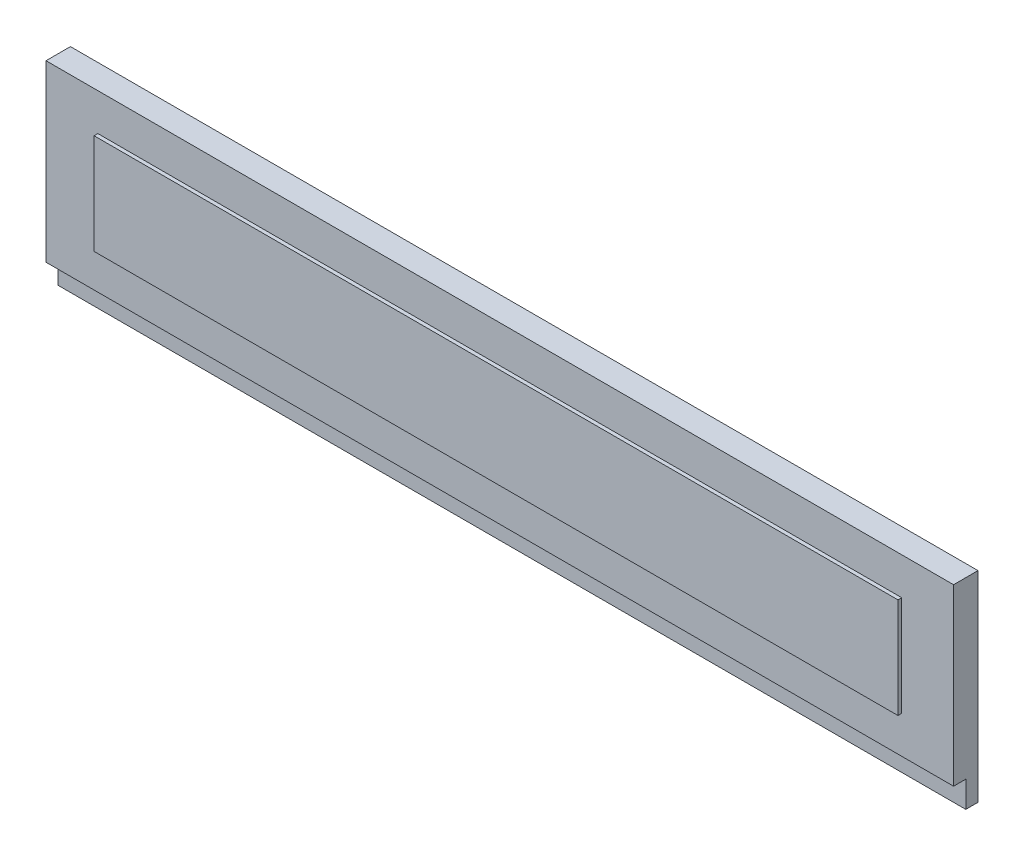
ISO-10303-21;
HEADER;
FILE_DESCRIPTION(('STEP AP214'),'2;1');
FILE_NAME('part.step','',(''),(''),'','','');
FILE_SCHEMA(('AUTOMOTIVE_DESIGN { 1 0 10303 214 1 1 1 1 }'));
ENDSEC;
DATA;
#1=APPLICATION_CONTEXT('core data for automotive mechanical design processes');
#2=APPLICATION_PROTOCOL_DEFINITION('international standard','automotive_design',2000,#1);
#3=PRODUCT_CONTEXT('',#1,'mechanical');
#4=PRODUCT('Part','Part','',(#3));
#5=PRODUCT_RELATED_PRODUCT_CATEGORY('part','',(#4));
#6=PRODUCT_DEFINITION_FORMATION('','',#4);
#7=PRODUCT_DEFINITION_CONTEXT('part definition',#1,'design');
#8=PRODUCT_DEFINITION('design','',#6,#7);
#9=PRODUCT_DEFINITION_SHAPE('','',#8);
#10=(LENGTH_UNIT() NAMED_UNIT(*) SI_UNIT(.MILLI.,.METRE.));
#11=(NAMED_UNIT(*) PLANE_ANGLE_UNIT() SI_UNIT($,.RADIAN.));
#12=(NAMED_UNIT(*) SI_UNIT($,.STERADIAN.) SOLID_ANGLE_UNIT());
#13=UNCERTAINTY_MEASURE_WITH_UNIT(LENGTH_MEASURE(1.E-05),#10,'distance_accuracy_value','');
#14=(GEOMETRIC_REPRESENTATION_CONTEXT(3) GLOBAL_UNCERTAINTY_ASSIGNED_CONTEXT((#13)) GLOBAL_UNIT_ASSIGNED_CONTEXT((#10,
#11,#12)) REPRESENTATION_CONTEXT('',''));
#15=CARTESIAN_POINT('',(0.,0.,0.));
#16=DIRECTION('',(0.,0.,1.));
#17=DIRECTION('',(1.,0.,0.));
#18=AXIS2_PLACEMENT_3D('',#15,#16,#17);
#19=CARTESIAN_POINT('',(0.,0.,0.7));
#20=DIRECTION('',(0.,0.,-1.));
#21=DIRECTION('',(-1.,0.,0.));
#22=AXIS2_PLACEMENT_3D('',#19,#20,#21);
#23=PLANE('',#22);
#24=DIRECTION('',(1.,0.,0.));
#25=VECTOR('',#24,1.);
#26=CARTESIAN_POINT('',(-26.,-4.25,0.7));
#27=LINE('',#26,#25);
#28=CARTESIAN_POINT('',(-26.,-4.25,0.7));
#29=VERTEX_POINT('',#28);
#30=CARTESIAN_POINT('',(26.,-4.25,0.7));
#31=VERTEX_POINT('',#30);
#32=EDGE_CURVE('E221',#29,#31,#27,.T.);
#33=ORIENTED_EDGE('',*,*,#32,.F.);
#34=DIRECTION('',(0.,-1.,0.));
#35=VECTOR('',#34,1.);
#36=CARTESIAN_POINT('',(-26.,-5.75,0.7));
#37=LINE('',#36,#35);
#38=CARTESIAN_POINT('',(-26.,-5.75,0.7));
#39=VERTEX_POINT('',#38);
#40=EDGE_CURVE('E252',#29,#39,#37,.T.);
#41=ORIENTED_EDGE('',*,*,#40,.T.);
#42=DIRECTION('',(1.,0.,0.));
#43=VECTOR('',#42,1.);
#44=CARTESIAN_POINT('',(-26.,-5.75,0.7));
#45=LINE('',#44,#43);
#46=CARTESIAN_POINT('',(26.,-5.75,0.7));
#47=VERTEX_POINT('',#46);
#48=EDGE_CURVE('E256',#39,#47,#45,.T.);
#49=ORIENTED_EDGE('',*,*,#48,.T.);
#50=DIRECTION('',(0.,1.,0.));
#51=VECTOR('',#50,1.);
#52=CARTESIAN_POINT('',(26.,-5.75,0.7));
#53=LINE('',#52,#51);
#54=EDGE_CURVE('E249',#47,#31,#53,.T.);
#55=ORIENTED_EDGE('',*,*,#54,.T.);
#56=EDGE_LOOP('',(#33,#41,#49,#55));
#57=FACE_BOUND('',#56,.T.);
#58=ADVANCED_FACE('F45',(#57),#23,.F.);
#59=CARTESIAN_POINT('',(26.,-5.75,0.7));
#60=DIRECTION('',(-1.,0.,0.));
#61=DIRECTION('',(0.,0.,1.));
#62=AXIS2_PLACEMENT_3D('',#59,#60,#61);
#63=PLANE('',#62);
#64=DIRECTION('',(0.,1.,0.));
#65=VECTOR('',#64,1.);
#66=CARTESIAN_POINT('',(26.,-5.75,0.));
#67=LINE('',#66,#65);
#68=CARTESIAN_POINT('',(26.,-5.75,0.));
#69=VERTEX_POINT('',#68);
#70=CARTESIAN_POINT('',(26.,5.75,0.));
#71=VERTEX_POINT('',#70);
#72=EDGE_CURVE('E248',#69,#71,#67,.T.);
#73=ORIENTED_EDGE('',*,*,#72,.T.);
#74=DIRECTION('',(0.,0.,-1.));
#75=VECTOR('',#74,1.);
#76=CARTESIAN_POINT('',(26.,5.75,0.7));
#77=LINE('',#76,#75);
#78=CARTESIAN_POINT('',(26.,5.75,1.4));
#79=VERTEX_POINT('',#78);
#80=EDGE_CURVE('E11',#79,#71,#77,.T.);
#81=ORIENTED_EDGE('',*,*,#80,.F.);
#82=DIRECTION('',(0.,1.,0.));
#83=VECTOR('',#82,1.);
#84=CARTESIAN_POINT('',(26.,5.75,1.4));
#85=LINE('',#84,#83);
#86=CARTESIAN_POINT('',(26.,-4.25,1.4));
#87=VERTEX_POINT('',#86);
#88=EDGE_CURVE('E229',#87,#79,#85,.T.);
#89=ORIENTED_EDGE('',*,*,#88,.F.);
#90=DIRECTION('',(0.,0.,-1.));
#91=VECTOR('',#90,1.);
#92=CARTESIAN_POINT('',(26.,-4.25,1.4));
#93=LINE('',#92,#91);
#94=EDGE_CURVE('E237',#87,#31,#93,.T.);
#95=ORIENTED_EDGE('',*,*,#94,.T.);
#96=ORIENTED_EDGE('',*,*,#54,.F.);
#97=DIRECTION('',(0.,0.,-1.));
#98=VECTOR('',#97,1.);
#99=CARTESIAN_POINT('',(26.,-5.75,0.7));
#100=LINE('',#99,#98);
#101=EDGE_CURVE('E259',#47,#69,#100,.T.);
#102=ORIENTED_EDGE('',*,*,#101,.T.);
#103=EDGE_LOOP('',(#73,#81,#89,#95,#96,#102));
#104=FACE_BOUND('',#103,.T.);
#105=ADVANCED_FACE('F47',(#104),#63,.F.);
#106=CARTESIAN_POINT('',(-26.,5.75,0.7));
#107=DIRECTION('',(0.,-1.,0.));
#108=DIRECTION('',(0.,0.,-1.));
#109=AXIS2_PLACEMENT_3D('',#106,#107,#108);
#110=PLANE('',#109);
#111=DIRECTION('',(-1.,0.,0.));
#112=VECTOR('',#111,1.);
#113=CARTESIAN_POINT('',(-26.,5.75,0.));
#114=LINE('',#113,#112);
#115=CARTESIAN_POINT('',(-26.,5.75,0.));
#116=VERTEX_POINT('',#115);
#117=EDGE_CURVE('E263',#71,#116,#114,.T.);
#118=ORIENTED_EDGE('',*,*,#117,.T.);
#119=DIRECTION('',(0.,0.,-1.));
#120=VECTOR('',#119,1.);
#121=CARTESIAN_POINT('',(-26.,5.75,0.7));
#122=LINE('',#121,#120);
#123=CARTESIAN_POINT('',(-26.,5.75,1.4));
#124=VERTEX_POINT('',#123);
#125=EDGE_CURVE('E54',#124,#116,#122,.T.);
#126=ORIENTED_EDGE('',*,*,#125,.F.);
#127=DIRECTION('',(-1.,0.,0.));
#128=VECTOR('',#127,1.);
#129=CARTESIAN_POINT('',(-26.,5.75,1.4));
#130=LINE('',#129,#128);
#131=EDGE_CURVE('E233',#79,#124,#130,.T.);
#132=ORIENTED_EDGE('',*,*,#131,.F.);
#133=ORIENTED_EDGE('',*,*,#80,.T.);
#134=EDGE_LOOP('',(#118,#126,#132,#133));
#135=FACE_BOUND('',#134,.T.);
#136=ADVANCED_FACE('F305',(#135),#110,.F.);
#137=CARTESIAN_POINT('',(-26.,-5.75,0.7));
#138=DIRECTION('',(1.,0.,0.));
#139=DIRECTION('',(0.,0.,-1.));
#140=AXIS2_PLACEMENT_3D('',#137,#138,#139);
#141=PLANE('',#140);
#142=DIRECTION('',(0.,-1.,0.));
#143=VECTOR('',#142,1.);
#144=CARTESIAN_POINT('',(-26.,-5.75,0.));
#145=LINE('',#144,#143);
#146=CARTESIAN_POINT('',(-26.,-5.75,0.));
#147=VERTEX_POINT('',#146);
#148=EDGE_CURVE('E266',#116,#147,#145,.T.);
#149=ORIENTED_EDGE('',*,*,#148,.T.);
#150=DIRECTION('',(0.,0.,-1.));
#151=VECTOR('',#150,1.);
#152=CARTESIAN_POINT('',(-26.,-5.75,0.7));
#153=LINE('',#152,#151);
#154=EDGE_CURVE('E274',#39,#147,#153,.T.);
#155=ORIENTED_EDGE('',*,*,#154,.F.);
#156=ORIENTED_EDGE('',*,*,#40,.F.);
#157=DIRECTION('',(0.,0.,-1.));
#158=VECTOR('',#157,1.);
#159=CARTESIAN_POINT('',(-26.,-4.25,1.4));
#160=LINE('',#159,#158);
#161=CARTESIAN_POINT('',(-26.,-4.25,1.4));
#162=VERTEX_POINT('',#161);
#163=EDGE_CURVE('E244',#162,#29,#160,.T.);
#164=ORIENTED_EDGE('',*,*,#163,.F.);
#165=DIRECTION('',(0.,-1.,0.));
#166=VECTOR('',#165,1.);
#167=CARTESIAN_POINT('',(-26.,5.75,1.4));
#168=LINE('',#167,#166);
#169=EDGE_CURVE('E222',#124,#162,#168,.T.);
#170=ORIENTED_EDGE('',*,*,#169,.F.);
#171=ORIENTED_EDGE('',*,*,#125,.T.);
#172=EDGE_LOOP('',(#149,#155,#156,#164,#170,#171));
#173=FACE_BOUND('',#172,.T.);
#174=ADVANCED_FACE('F282',(#173),#141,.F.);
#175=CARTESIAN_POINT('',(-26.,-5.75,0.7));
#176=DIRECTION('',(0.,1.,0.));
#177=DIRECTION('',(0.,0.,1.));
#178=AXIS2_PLACEMENT_3D('',#175,#176,#177);
#179=PLANE('',#178);
#180=DIRECTION('',(1.,0.,0.));
#181=VECTOR('',#180,1.);
#182=CARTESIAN_POINT('',(-26.,-5.75,0.));
#183=LINE('',#182,#181);
#184=EDGE_CURVE('E253',#147,#69,#183,.T.);
#185=ORIENTED_EDGE('',*,*,#184,.T.);
#186=ORIENTED_EDGE('',*,*,#101,.F.);
#187=ORIENTED_EDGE('',*,*,#48,.F.);
#188=ORIENTED_EDGE('',*,*,#154,.T.);
#189=EDGE_LOOP('',(#185,#186,#187,#188));
#190=FACE_BOUND('',#189,.T.);
#191=ADVANCED_FACE('F293',(#190),#179,.F.);
#192=CARTESIAN_POINT('',(0.,0.,0.));
#193=DIRECTION('',(0.,0.,-1.));
#194=DIRECTION('',(-1.,0.,0.));
#195=AXIS2_PLACEMENT_3D('',#192,#193,#194);
#196=PLANE('',#195);
#197=DIRECTION('',(0.,1.,0.));
#198=VECTOR('',#197,1.);
#199=CARTESIAN_POINT('',(-25.5,-3.49999999999999,0.));
#200=LINE('',#199,#198);
#201=CARTESIAN_POINT('',(-25.5,-3.49999999999999,0.));
#202=VERTEX_POINT('',#201);
#203=CARTESIAN_POINT('',(-25.5,5.00000000000001,0.));
#204=VERTEX_POINT('',#203);
#205=EDGE_CURVE('E61',#202,#204,#200,.T.);
#206=ORIENTED_EDGE('',*,*,#205,.F.);
#207=DIRECTION('',(-1.,0.,0.));
#208=VECTOR('',#207,1.);
#209=CARTESIAN_POINT('',(25.5,-3.49999999999999,0.));
#210=LINE('',#209,#208);
#211=CARTESIAN_POINT('',(25.5,-3.49999999999999,0.));
#212=VERTEX_POINT('',#211);
#213=EDGE_CURVE('E65',#212,#202,#210,.T.);
#214=ORIENTED_EDGE('',*,*,#213,.F.);
#215=DIRECTION('',(0.,-1.,0.));
#216=VECTOR('',#215,1.);
#217=CARTESIAN_POINT('',(25.5,-3.49999999999999,0.));
#218=LINE('',#217,#216);
#219=CARTESIAN_POINT('',(25.5,5.00000000000001,0.));
#220=VERTEX_POINT('',#219);
#221=EDGE_CURVE('E473',#220,#212,#218,.T.);
#222=ORIENTED_EDGE('',*,*,#221,.F.);
#223=DIRECTION('',(1.,0.,0.));
#224=VECTOR('',#223,1.);
#225=CARTESIAN_POINT('',(25.5,5.00000000000001,0.));
#226=LINE('',#225,#224);
#227=EDGE_CURVE('E483',#204,#220,#226,.T.);
#228=ORIENTED_EDGE('',*,*,#227,.F.);
#229=EDGE_LOOP('',(#206,#214,#222,#228));
#230=FACE_BOUND('',#229,.T.);
#231=ORIENTED_EDGE('',*,*,#72,.F.);
#232=ORIENTED_EDGE('',*,*,#184,.F.);
#233=ORIENTED_EDGE('',*,*,#148,.F.);
#234=ORIENTED_EDGE('',*,*,#117,.F.);
#235=EDGE_LOOP('',(#231,#232,#233,#234));
#236=FACE_BOUND('',#235,.T.);
#237=ADVANCED_FACE('F290',(#230,#236),#196,.T.);
#238=CARTESIAN_POINT('',(-26.,-4.25,1.4));
#239=DIRECTION('',(0.,1.,0.));
#240=DIRECTION('',(0.,0.,1.));
#241=AXIS2_PLACEMENT_3D('',#238,#239,#240);
#242=PLANE('',#241);
#243=ORIENTED_EDGE('',*,*,#32,.T.);
#244=ORIENTED_EDGE('',*,*,#94,.F.);
#245=DIRECTION('',(1.,0.,0.));
#246=VECTOR('',#245,1.);
#247=CARTESIAN_POINT('',(-26.,-4.25,1.4));
#248=LINE('',#247,#246);
#249=EDGE_CURVE('E226',#162,#87,#248,.T.);
#250=ORIENTED_EDGE('',*,*,#249,.F.);
#251=ORIENTED_EDGE('',*,*,#163,.T.);
#252=EDGE_LOOP('',(#243,#244,#250,#251));
#253=FACE_BOUND('',#252,.T.);
#254=ADVANCED_FACE('F302',(#253),#242,.F.);
#255=CARTESIAN_POINT('',(0.,0.,1.4));
#256=DIRECTION('',(0.,0.,1.));
#257=DIRECTION('',(1.,0.,0.));
#258=AXIS2_PLACEMENT_3D('',#255,#256,#257);
#259=PLANE('',#258);
#260=DIRECTION('',(0.,1.,0.));
#261=VECTOR('',#260,1.);
#262=CARTESIAN_POINT('',(23.03,3.62000000000001,1.4));
#263=LINE('',#262,#261);
#264=CARTESIAN_POINT('',(23.03,-2.11999999999999,1.4));
#265=VERTEX_POINT('',#264);
#266=CARTESIAN_POINT('',(23.03,3.62000000000001,1.4));
#267=VERTEX_POINT('',#266);
#268=EDGE_CURVE('E170',#265,#267,#263,.T.);
#269=ORIENTED_EDGE('',*,*,#268,.F.);
#270=DIRECTION('',(1.,0.,0.));
#271=VECTOR('',#270,1.);
#272=CARTESIAN_POINT('',(-23.03,-2.11999999999999,1.4));
#273=LINE('',#272,#271);
#274=CARTESIAN_POINT('',(-23.03,-2.11999999999999,1.4));
#275=VERTEX_POINT('',#274);
#276=EDGE_CURVE('E186',#275,#265,#273,.T.);
#277=ORIENTED_EDGE('',*,*,#276,.F.);
#278=DIRECTION('',(0.,-1.,0.));
#279=VECTOR('',#278,1.);
#280=CARTESIAN_POINT('',(-23.03,3.62000000000001,1.4));
#281=LINE('',#280,#279);
#282=CARTESIAN_POINT('',(-23.03,3.62000000000001,1.4));
#283=VERTEX_POINT('',#282);
#284=EDGE_CURVE('E199',#283,#275,#281,.T.);
#285=ORIENTED_EDGE('',*,*,#284,.F.);
#286=DIRECTION('',(-1.,0.,0.));
#287=VECTOR('',#286,1.);
#288=CARTESIAN_POINT('',(-23.03,3.62000000000001,1.4));
#289=LINE('',#288,#287);
#290=EDGE_CURVE('E175',#267,#283,#289,.T.);
#291=ORIENTED_EDGE('',*,*,#290,.F.);
#292=EDGE_LOOP('',(#269,#277,#285,#291));
#293=FACE_BOUND('',#292,.T.);
#294=ORIENTED_EDGE('',*,*,#169,.T.);
#295=ORIENTED_EDGE('',*,*,#249,.T.);
#296=ORIENTED_EDGE('',*,*,#88,.T.);
#297=ORIENTED_EDGE('',*,*,#131,.T.);
#298=EDGE_LOOP('',(#294,#295,#296,#297));
#299=FACE_BOUND('',#298,.T.);
#300=ADVANCED_FACE('F304',(#293,#299),#259,.T.);
#301=CARTESIAN_POINT('',(23.03,3.62000000000001,1.615));
#302=DIRECTION('',(-1.,0.,0.));
#303=DIRECTION('',(0.,0.,1.));
#304=AXIS2_PLACEMENT_3D('',#301,#302,#303);
#305=PLANE('',#304);
#306=ORIENTED_EDGE('',*,*,#268,.T.);
#307=DIRECTION('',(0.,0.,-1.));
#308=VECTOR('',#307,1.);
#309=CARTESIAN_POINT('',(23.03,3.62000000000001,1.615));
#310=LINE('',#309,#308);
#311=CARTESIAN_POINT('',(23.03,3.62000000000001,1.615));
#312=VERTEX_POINT('',#311);
#313=EDGE_CURVE('E217',#312,#267,#310,.T.);
#314=ORIENTED_EDGE('',*,*,#313,.F.);
#315=DIRECTION('',(0.,1.,0.));
#316=VECTOR('',#315,1.);
#317=CARTESIAN_POINT('',(23.03,3.62000000000001,1.615));
#318=LINE('',#317,#316);
#319=CARTESIAN_POINT('',(23.03,-2.11999999999999,1.615));
#320=VERTEX_POINT('',#319);
#321=EDGE_CURVE('E181',#320,#312,#318,.T.);
#322=ORIENTED_EDGE('',*,*,#321,.F.);
#323=DIRECTION('',(0.,0.,-1.));
#324=VECTOR('',#323,1.);
#325=CARTESIAN_POINT('',(23.03,-2.11999999999999,1.615));
#326=LINE('',#325,#324);
#327=EDGE_CURVE('E194',#320,#265,#326,.T.);
#328=ORIENTED_EDGE('',*,*,#327,.T.);
#329=EDGE_LOOP('',(#306,#314,#322,#328));
#330=FACE_BOUND('',#329,.T.);
#331=ADVANCED_FACE('F375',(#330),#305,.F.);
#332=CARTESIAN_POINT('',(-23.03,3.62000000000001,1.615));
#333=DIRECTION('',(0.,-1.,0.));
#334=DIRECTION('',(0.,0.,-1.));
#335=AXIS2_PLACEMENT_3D('',#332,#333,#334);
#336=PLANE('',#335);
#337=ORIENTED_EDGE('',*,*,#290,.T.);
#338=DIRECTION('',(0.,0.,-1.));
#339=VECTOR('',#338,1.);
#340=CARTESIAN_POINT('',(-23.03,3.62000000000001,1.615));
#341=LINE('',#340,#339);
#342=CARTESIAN_POINT('',(-23.03,3.62000000000001,1.615));
#343=VERTEX_POINT('',#342);
#344=EDGE_CURVE('E213',#343,#283,#341,.T.);
#345=ORIENTED_EDGE('',*,*,#344,.F.);
#346=DIRECTION('',(-1.,0.,0.));
#347=VECTOR('',#346,1.);
#348=CARTESIAN_POINT('',(-23.03,3.62000000000001,1.615));
#349=LINE('',#348,#347);
#350=EDGE_CURVE('E185',#312,#343,#349,.T.);
#351=ORIENTED_EDGE('',*,*,#350,.F.);
#352=ORIENTED_EDGE('',*,*,#313,.T.);
#353=EDGE_LOOP('',(#337,#345,#351,#352));
#354=FACE_BOUND('',#353,.T.);
#355=ADVANCED_FACE('F384',(#354),#336,.F.);
#356=CARTESIAN_POINT('',(-23.03,3.62000000000001,1.615));
#357=DIRECTION('',(1.,0.,0.));
#358=DIRECTION('',(0.,0.,-1.));
#359=AXIS2_PLACEMENT_3D('',#356,#357,#358);
#360=PLANE('',#359);
#361=ORIENTED_EDGE('',*,*,#284,.T.);
#362=DIRECTION('',(0.,0.,-1.));
#363=VECTOR('',#362,1.);
#364=CARTESIAN_POINT('',(-23.03,-2.11999999999999,1.615));
#365=LINE('',#364,#363);
#366=CARTESIAN_POINT('',(-23.03,-2.11999999999999,1.615));
#367=VERTEX_POINT('',#366);
#368=EDGE_CURVE('E209',#367,#275,#365,.T.);
#369=ORIENTED_EDGE('',*,*,#368,.F.);
#370=DIRECTION('',(0.,-1.,0.));
#371=VECTOR('',#370,1.);
#372=CARTESIAN_POINT('',(-23.03,3.62000000000001,1.615));
#373=LINE('',#372,#371);
#374=EDGE_CURVE('E189',#343,#367,#373,.T.);
#375=ORIENTED_EDGE('',*,*,#374,.F.);
#376=ORIENTED_EDGE('',*,*,#344,.T.);
#377=EDGE_LOOP('',(#361,#369,#375,#376));
#378=FACE_BOUND('',#377,.T.);
#379=ADVANCED_FACE('F394',(#378),#360,.F.);
#380=CARTESIAN_POINT('',(-23.03,-2.11999999999999,1.615));
#381=DIRECTION('',(0.,1.,0.));
#382=DIRECTION('',(0.,0.,1.));
#383=AXIS2_PLACEMENT_3D('',#380,#381,#382);
#384=PLANE('',#383);
#385=ORIENTED_EDGE('',*,*,#276,.T.);
#386=ORIENTED_EDGE('',*,*,#327,.F.);
#387=DIRECTION('',(1.,0.,0.));
#388=VECTOR('',#387,1.);
#389=CARTESIAN_POINT('',(-23.03,-2.11999999999999,1.615));
#390=LINE('',#389,#388);
#391=EDGE_CURVE('E192',#367,#320,#390,.T.);
#392=ORIENTED_EDGE('',*,*,#391,.F.);
#393=ORIENTED_EDGE('',*,*,#368,.T.);
#394=EDGE_LOOP('',(#385,#386,#392,#393));
#395=FACE_BOUND('',#394,.T.);
#396=ADVANCED_FACE('F404',(#395),#384,.F.);
#397=CARTESIAN_POINT('',(0.,0.,1.615));
#398=DIRECTION('',(0.,0.,1.));
#399=DIRECTION('',(1.,0.,0.));
#400=AXIS2_PLACEMENT_3D('',#397,#398,#399);
#401=PLANE('',#400);
#402=ORIENTED_EDGE('',*,*,#321,.T.);
#403=ORIENTED_EDGE('',*,*,#350,.T.);
#404=ORIENTED_EDGE('',*,*,#374,.T.);
#405=ORIENTED_EDGE('',*,*,#391,.T.);
#406=EDGE_LOOP('',(#402,#403,#404,#405));
#407=FACE_BOUND('',#406,.T.);
#408=ADVANCED_FACE('F414',(#407),#401,.T.);
#409=CARTESIAN_POINT('',(-25.5,-3.49999999999999,-0.215));
#410=DIRECTION('',(1.,0.,0.));
#411=DIRECTION('',(0.,0.,-1.));
#412=AXIS2_PLACEMENT_3D('',#409,#410,#411);
#413=PLANE('',#412);
#414=ORIENTED_EDGE('',*,*,#205,.T.);
#415=DIRECTION('',(0.,0.,1.));
#416=VECTOR('',#415,1.);
#417=CARTESIAN_POINT('',(-25.5,5.00000000000001,-0.215));
#418=LINE('',#417,#416);
#419=CARTESIAN_POINT('',(-25.5,5.00000000000001,-0.215));
#420=VERTEX_POINT('',#419);
#421=EDGE_CURVE('E150',#420,#204,#418,.T.);
#422=ORIENTED_EDGE('',*,*,#421,.F.);
#423=DIRECTION('',(0.,1.,0.));
#424=VECTOR('',#423,1.);
#425=CARTESIAN_POINT('',(-25.5,-3.49999999999999,-0.215));
#426=LINE('',#425,#424);
#427=CARTESIAN_POINT('',(-25.5,-3.49999999999999,-0.215));
#428=VERTEX_POINT('',#427);
#429=EDGE_CURVE('E157',#428,#420,#426,.T.);
#430=ORIENTED_EDGE('',*,*,#429,.F.);
#431=DIRECTION('',(0.,0.,1.));
#432=VECTOR('',#431,1.);
#433=CARTESIAN_POINT('',(-25.5,-3.49999999999999,-0.215));
#434=LINE('',#433,#432);
#435=EDGE_CURVE('E470',#428,#202,#434,.T.);
#436=ORIENTED_EDGE('',*,*,#435,.T.);
#437=EDGE_LOOP('',(#414,#422,#430,#436));
#438=FACE_BOUND('',#437,.T.);
#439=ADVANCED_FACE('F168',(#438),#413,.F.);
#440=CARTESIAN_POINT('',(25.5,5.00000000000001,-0.215));
#441=DIRECTION('',(0.,-1.,0.));
#442=DIRECTION('',(0.,0.,-1.));
#443=AXIS2_PLACEMENT_3D('',#440,#441,#442);
#444=PLANE('',#443);
#445=ORIENTED_EDGE('',*,*,#227,.T.);
#446=DIRECTION('',(0.,0.,1.));
#447=VECTOR('',#446,1.);
#448=CARTESIAN_POINT('',(25.5,5.00000000000001,-0.215));
#449=LINE('',#448,#447);
#450=CARTESIAN_POINT('',(25.5,5.00000000000001,-0.215));
#451=VERTEX_POINT('',#450);
#452=EDGE_CURVE('E152',#451,#220,#449,.T.);
#453=ORIENTED_EDGE('',*,*,#452,.F.);
#454=DIRECTION('',(1.,0.,0.));
#455=VECTOR('',#454,1.);
#456=CARTESIAN_POINT('',(25.5,5.00000000000001,-0.215));
#457=LINE('',#456,#455);
#458=EDGE_CURVE('E145',#420,#451,#457,.T.);
#459=ORIENTED_EDGE('',*,*,#458,.F.);
#460=ORIENTED_EDGE('',*,*,#421,.T.);
#461=EDGE_LOOP('',(#445,#453,#459,#460));
#462=FACE_BOUND('',#461,.T.);
#463=ADVANCED_FACE('F148',(#462),#444,.F.);
#464=CARTESIAN_POINT('',(25.5,-3.49999999999999,-0.215));
#465=DIRECTION('',(-1.,0.,0.));
#466=DIRECTION('',(0.,0.,1.));
#467=AXIS2_PLACEMENT_3D('',#464,#465,#466);
#468=PLANE('',#467);
#469=ORIENTED_EDGE('',*,*,#221,.T.);
#470=DIRECTION('',(0.,0.,1.));
#471=VECTOR('',#470,1.);
#472=CARTESIAN_POINT('',(25.5,-3.49999999999999,-0.215));
#473=LINE('',#472,#471);
#474=CARTESIAN_POINT('',(25.5,-3.49999999999999,-0.215));
#475=VERTEX_POINT('',#474);
#476=EDGE_CURVE('E177',#475,#212,#473,.T.);
#477=ORIENTED_EDGE('',*,*,#476,.F.);
#478=DIRECTION('',(0.,-1.,0.));
#479=VECTOR('',#478,1.);
#480=CARTESIAN_POINT('',(25.5,-3.49999999999999,-0.215));
#481=LINE('',#480,#479);
#482=EDGE_CURVE('E156',#451,#475,#481,.T.);
#483=ORIENTED_EDGE('',*,*,#482,.F.);
#484=ORIENTED_EDGE('',*,*,#452,.T.);
#485=EDGE_LOOP('',(#469,#477,#483,#484));
#486=FACE_BOUND('',#485,.T.);
#487=ADVANCED_FACE('F439',(#486),#468,.F.);
#488=CARTESIAN_POINT('',(25.5,-3.49999999999999,-0.215));
#489=DIRECTION('',(0.,1.,0.));
#490=DIRECTION('',(0.,0.,1.));
#491=AXIS2_PLACEMENT_3D('',#488,#489,#490);
#492=PLANE('',#491);
#493=ORIENTED_EDGE('',*,*,#213,.T.);
#494=ORIENTED_EDGE('',*,*,#435,.F.);
#495=DIRECTION('',(-1.,0.,0.));
#496=VECTOR('',#495,1.);
#497=CARTESIAN_POINT('',(25.5,-3.49999999999999,-0.215));
#498=LINE('',#497,#496);
#499=EDGE_CURVE('E162',#475,#428,#498,.T.);
#500=ORIENTED_EDGE('',*,*,#499,.F.);
#501=ORIENTED_EDGE('',*,*,#476,.T.);
#502=EDGE_LOOP('',(#493,#494,#500,#501));
#503=FACE_BOUND('',#502,.T.);
#504=ADVANCED_FACE('F448',(#503),#492,.F.);
#505=CARTESIAN_POINT('',(0.,0.,-0.215));
#506=DIRECTION('',(0.,0.,1.));
#507=DIRECTION('',(1.,0.,0.));
#508=AXIS2_PLACEMENT_3D('',#505,#506,#507);
#509=PLANE('',#508);
#510=ORIENTED_EDGE('',*,*,#429,.T.);
#511=ORIENTED_EDGE('',*,*,#458,.T.);
#512=ORIENTED_EDGE('',*,*,#482,.T.);
#513=ORIENTED_EDGE('',*,*,#499,.T.);
#514=EDGE_LOOP('',(#510,#511,#512,#513));
#515=FACE_BOUND('',#514,.T.);
#516=ADVANCED_FACE('F160',(#515),#509,.F.);
#517=CLOSED_SHELL('',(#58,#105,#136,#174,#191,#237,#254,#300,#331,#355,#379,#396,#408,#439,#463,
#487,#504,#516));
#518=MANIFOLD_SOLID_BREP('B2',#517);
#519=ADVANCED_BREP_SHAPE_REPRESENTATION('',(#18,#518),#14);
#520=SHAPE_DEFINITION_REPRESENTATION(#9,#519);
ENDSEC;
END-ISO-10303-21;
